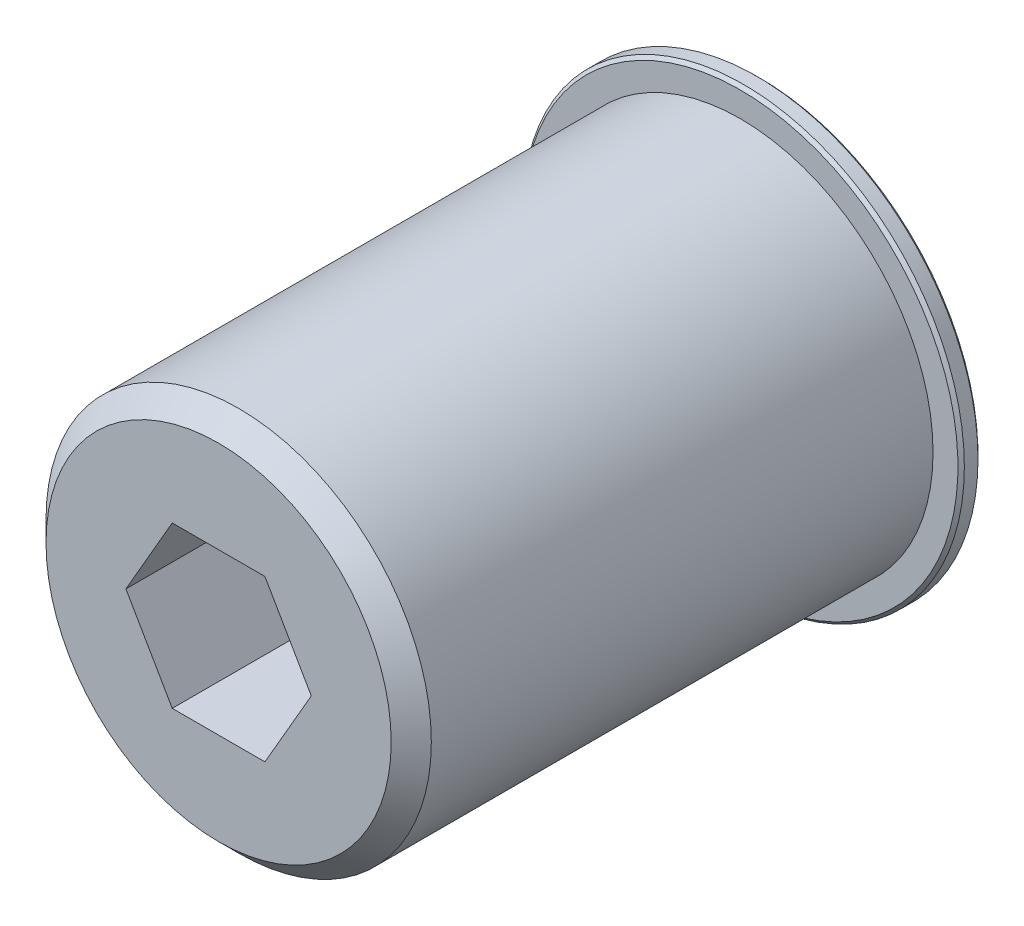
ISO-10303-21;
HEADER;
FILE_DESCRIPTION(('STEP AP214'),'2;1');
FILE_NAME('part.step','',(''),(''),'','','');
FILE_SCHEMA(('AUTOMOTIVE_DESIGN { 1 0 10303 214 1 1 1 1 }'));
ENDSEC;
DATA;
#1=APPLICATION_CONTEXT('core data for automotive mechanical design processes');
#2=APPLICATION_PROTOCOL_DEFINITION('international standard','automotive_design',2000,#1);
#3=PRODUCT_CONTEXT('',#1,'mechanical');
#4=PRODUCT('Part','Part','',(#3));
#5=PRODUCT_RELATED_PRODUCT_CATEGORY('part','',(#4));
#6=PRODUCT_DEFINITION_FORMATION('','',#4);
#7=PRODUCT_DEFINITION_CONTEXT('part definition',#1,'design');
#8=PRODUCT_DEFINITION('design','',#6,#7);
#9=PRODUCT_DEFINITION_SHAPE('','',#8);
#10=(LENGTH_UNIT() NAMED_UNIT(*) SI_UNIT(.MILLI.,.METRE.));
#11=(NAMED_UNIT(*) PLANE_ANGLE_UNIT() SI_UNIT($,.RADIAN.));
#12=(NAMED_UNIT(*) SI_UNIT($,.STERADIAN.) SOLID_ANGLE_UNIT());
#13=UNCERTAINTY_MEASURE_WITH_UNIT(LENGTH_MEASURE(1.E-05),#10,'distance_accuracy_value','');
#14=(GEOMETRIC_REPRESENTATION_CONTEXT(3) GLOBAL_UNCERTAINTY_ASSIGNED_CONTEXT((#13)) GLOBAL_UNIT_ASSIGNED_CONTEXT((#10,
#11,#12)) REPRESENTATION_CONTEXT('',''));
#15=CARTESIAN_POINT('',(0.,0.,0.));
#16=DIRECTION('',(0.,0.,1.));
#17=DIRECTION('',(1.,0.,0.));
#18=AXIS2_PLACEMENT_3D('',#15,#16,#17);
#19=CARTESIAN_POINT('',(0.,0.,-20.6375));
#20=DIRECTION('',(0.,0.,1.));
#21=DIRECTION('',(1.,0.,0.));
#22=AXIS2_PLACEMENT_3D('',#19,#20,#21);
#23=CYLINDRICAL_SURFACE('',#22,15.24);
#24=CARTESIAN_POINT('',(0.,0.,19.05));
#25=DIRECTION('',(0.,0.,1.));
#26=DIRECTION('',(1.,0.,0.));
#27=AXIS2_PLACEMENT_3D('',#24,#25,#26);
#28=CIRCLE('',#27,15.24);
#29=CARTESIAN_POINT('',(15.24,0.,19.05));
#30=VERTEX_POINT('',#29);
#31=EDGE_CURVE('E143',#30,#30,#28,.F.);
#32=ORIENTED_EDGE('',*,*,#31,.T.);
#33=EDGE_LOOP('',(#32));
#34=FACE_BOUND('',#33,.T.);
#35=CARTESIAN_POINT('',(0.,0.,-20.6375));
#36=DIRECTION('',(0.,0.,-1.));
#37=DIRECTION('',(-1.,0.,0.));
#38=AXIS2_PLACEMENT_3D('',#35,#36,#37);
#39=CIRCLE('',#38,15.24);
#40=CARTESIAN_POINT('',(-15.24,0.,-20.6375));
#41=VERTEX_POINT('',#40);
#42=EDGE_CURVE('E130',#41,#41,#39,.F.);
#43=ORIENTED_EDGE('',*,*,#42,.T.);
#44=EDGE_LOOP('',(#43));
#45=FACE_BOUND('',#44,.T.);
#46=ADVANCED_FACE('F32',(#34,#45),#23,.T.);
#47=CARTESIAN_POINT('',(0.,0.,20.6375));
#48=DIRECTION('',(0.,0.,1.));
#49=DIRECTION('',(1.,0.,0.));
#50=AXIS2_PLACEMENT_3D('',#47,#48,#49);
#51=PLANE('',#50);
#52=DIRECTION('',(-0.5,0.866025403784439,0.));
#53=VECTOR('',#52,1.);
#54=CARTESIAN_POINT('',(-3.66617420935412,-6.35,20.6375));
#55=LINE('',#54,#53);
#56=CARTESIAN_POINT('',(-3.66617420935412,-6.35,20.6375));
#57=VERTEX_POINT('',#56);
#58=CARTESIAN_POINT('',(-7.33234841870825,0.,20.6375));
#59=VERTEX_POINT('',#58);
#60=EDGE_CURVE('E87',#57,#59,#55,.T.);
#61=ORIENTED_EDGE('',*,*,#60,.T.);
#62=DIRECTION('',(0.5,0.866025403784439,0.));
#63=VECTOR('',#62,1.);
#64=CARTESIAN_POINT('',(-7.33234841870825,0.,20.6375));
#65=LINE('',#64,#63);
#66=CARTESIAN_POINT('',(-3.66617420935412,6.35,20.6375));
#67=VERTEX_POINT('',#66);
#68=EDGE_CURVE('E96',#59,#67,#65,.T.);
#69=ORIENTED_EDGE('',*,*,#68,.T.);
#70=DIRECTION('',(1.,0.,0.));
#71=VECTOR('',#70,1.);
#72=CARTESIAN_POINT('',(-3.66617420935412,6.35,20.6375));
#73=LINE('',#72,#71);
#74=CARTESIAN_POINT('',(3.66617420935412,6.35,20.6375));
#75=VERTEX_POINT('',#74);
#76=EDGE_CURVE('E47',#67,#75,#73,.T.);
#77=ORIENTED_EDGE('',*,*,#76,.T.);
#78=DIRECTION('',(0.5,-0.866025403784439,0.));
#79=VECTOR('',#78,1.);
#80=CARTESIAN_POINT('',(3.66617420935412,6.35,20.6375));
#81=LINE('',#80,#79);
#82=CARTESIAN_POINT('',(7.33234841870825,0.,20.6375));
#83=VERTEX_POINT('',#82);
#84=EDGE_CURVE('E111',#75,#83,#81,.T.);
#85=ORIENTED_EDGE('',*,*,#84,.T.);
#86=DIRECTION('',(-0.5,-0.866025403784439,0.));
#87=VECTOR('',#86,1.);
#88=CARTESIAN_POINT('',(7.33234841870825,0.,20.6375));
#89=LINE('',#88,#87);
#90=CARTESIAN_POINT('',(3.66617420935412,-6.35,20.6375));
#91=VERTEX_POINT('',#90);
#92=EDGE_CURVE('E114',#83,#91,#89,.T.);
#93=ORIENTED_EDGE('',*,*,#92,.T.);
#94=DIRECTION('',(-1.,0.,0.));
#95=VECTOR('',#94,1.);
#96=CARTESIAN_POINT('',(3.66617420935412,-6.35,20.6375));
#97=LINE('',#96,#95);
#98=EDGE_CURVE('E93',#91,#57,#97,.T.);
#99=ORIENTED_EDGE('',*,*,#98,.T.);
#100=EDGE_LOOP('',(#61,#69,#77,#85,#93,#99));
#101=FACE_BOUND('',#100,.T.);
#102=CARTESIAN_POINT('',(0.,0.,20.6375));
#103=DIRECTION('',(0.,0.,1.));
#104=DIRECTION('',(1.,0.,0.));
#105=AXIS2_PLACEMENT_3D('',#102,#103,#104);
#106=CIRCLE('',#105,13.6525);
#107=CARTESIAN_POINT('',(13.6525,0.,20.6375));
#108=VERTEX_POINT('',#107);
#109=EDGE_CURVE('E140',#108,#108,#106,.T.);
#110=ORIENTED_EDGE('',*,*,#109,.T.);
#111=EDGE_LOOP('',(#110));
#112=FACE_BOUND('',#111,.T.);
#113=ADVANCED_FACE('F100',(#101,#112),#51,.T.);
#114=CARTESIAN_POINT('',(0.,0.,20.6375));
#115=DIRECTION('',(0.,0.,-1.));
#116=DIRECTION('',(-1.,0.,0.));
#117=AXIS2_PLACEMENT_3D('',#114,#115,#116);
#118=CONICAL_SURFACE('',#117,13.6525,0.785398163397448);
#119=ORIENTED_EDGE('',*,*,#31,.F.);
#120=EDGE_LOOP('',(#119));
#121=FACE_BOUND('',#120,.T.);
#122=ORIENTED_EDGE('',*,*,#109,.F.);
#123=EDGE_LOOP('',(#122));
#124=FACE_BOUND('',#123,.T.);
#125=ADVANCED_FACE('F166',(#121,#124),#118,.T.);
#126=CARTESIAN_POINT('',(0.,0.,-22.225));
#127=DIRECTION('',(0.,0.,1.));
#128=DIRECTION('',(1.,0.,0.));
#129=AXIS2_PLACEMENT_3D('',#126,#127,#128);
#130=CYLINDRICAL_SURFACE('',#129,17.4625);
#131=CARTESIAN_POINT('',(0.,0.,-20.8915));
#132=DIRECTION('',(0.,0.,-1.));
#133=DIRECTION('',(-1.,0.,0.));
#134=AXIS2_PLACEMENT_3D('',#131,#132,#133);
#135=CIRCLE('',#134,17.4625);
#136=CARTESIAN_POINT('',(-17.4625,0.,-20.8915));
#137=VERTEX_POINT('',#136);
#138=EDGE_CURVE('E149',#137,#137,#135,.T.);
#139=ORIENTED_EDGE('',*,*,#138,.T.);
#140=EDGE_LOOP('',(#139));
#141=FACE_BOUND('',#140,.T.);
#142=CARTESIAN_POINT('',(0.,0.,-21.971));
#143=DIRECTION('',(0.,0.,-1.));
#144=DIRECTION('',(-1.,0.,0.));
#145=AXIS2_PLACEMENT_3D('',#142,#143,#144);
#146=CIRCLE('',#145,17.4625);
#147=CARTESIAN_POINT('',(-17.4625,0.,-21.971));
#148=VERTEX_POINT('',#147);
#149=EDGE_CURVE('E146',#148,#148,#146,.F.);
#150=ORIENTED_EDGE('',*,*,#149,.T.);
#151=EDGE_LOOP('',(#150));
#152=FACE_BOUND('',#151,.T.);
#153=ADVANCED_FACE('F162',(#141,#152),#130,.T.);
#154=CARTESIAN_POINT('',(0.,0.,-22.225));
#155=DIRECTION('',(0.,0.,-1.));
#156=DIRECTION('',(-1.,0.,0.));
#157=AXIS2_PLACEMENT_3D('',#154,#155,#156);
#158=PLANE('',#157);
#159=CARTESIAN_POINT('',(0.,0.,-22.225));
#160=DIRECTION('',(0.,0.,-1.));
#161=DIRECTION('',(-1.,0.,0.));
#162=AXIS2_PLACEMENT_3D('',#159,#160,#161);
#163=CIRCLE('',#162,17.2085);
#164=CARTESIAN_POINT('',(-17.2085,0.,-22.225));
#165=VERTEX_POINT('',#164);
#166=EDGE_CURVE('E11',#165,#165,#163,.T.);
#167=ORIENTED_EDGE('',*,*,#166,.T.);
#168=EDGE_LOOP('',(#167));
#169=FACE_BOUND('',#168,.T.);
#170=DIRECTION('',(-0.5,0.866025403784439,0.));
#171=VECTOR('',#170,1.);
#172=CARTESIAN_POINT('',(-3.66617420935412,-6.35,-22.225));
#173=LINE('',#172,#171);
#174=CARTESIAN_POINT('',(-3.66617420935412,-6.35,-22.225));
#175=VERTEX_POINT('',#174);
#176=CARTESIAN_POINT('',(-7.33234841870825,0.,-22.225));
#177=VERTEX_POINT('',#176);
#178=EDGE_CURVE('E55',#175,#177,#173,.T.);
#179=ORIENTED_EDGE('',*,*,#178,.F.);
#180=DIRECTION('',(-1.,0.,0.));
#181=VECTOR('',#180,1.);
#182=CARTESIAN_POINT('',(3.66617420935412,-6.35,-22.225));
#183=LINE('',#182,#181);
#184=CARTESIAN_POINT('',(3.66617420935412,-6.35,-22.225));
#185=VERTEX_POINT('',#184);
#186=EDGE_CURVE('E104',#185,#175,#183,.T.);
#187=ORIENTED_EDGE('',*,*,#186,.F.);
#188=DIRECTION('',(-0.5,-0.866025403784439,0.));
#189=VECTOR('',#188,1.);
#190=CARTESIAN_POINT('',(7.33234841870825,0.,-22.225));
#191=LINE('',#190,#189);
#192=CARTESIAN_POINT('',(7.33234841870825,0.,-22.225));
#193=VERTEX_POINT('',#192);
#194=EDGE_CURVE('E107',#193,#185,#191,.T.);
#195=ORIENTED_EDGE('',*,*,#194,.F.);
#196=DIRECTION('',(0.5,-0.866025403784439,0.));
#197=VECTOR('',#196,1.);
#198=CARTESIAN_POINT('',(3.66617420935412,6.35,-22.225));
#199=LINE('',#198,#197);
#200=CARTESIAN_POINT('',(3.66617420935412,6.35,-22.225));
#201=VERTEX_POINT('',#200);
#202=EDGE_CURVE('E123',#201,#193,#199,.T.);
#203=ORIENTED_EDGE('',*,*,#202,.F.);
#204=DIRECTION('',(1.,0.,0.));
#205=VECTOR('',#204,1.);
#206=CARTESIAN_POINT('',(-3.66617420935412,6.35,-22.225));
#207=LINE('',#206,#205);
#208=CARTESIAN_POINT('',(-3.66617420935412,6.35,-22.225));
#209=VERTEX_POINT('',#208);
#210=EDGE_CURVE('E120',#209,#201,#207,.T.);
#211=ORIENTED_EDGE('',*,*,#210,.F.);
#212=DIRECTION('',(0.5,0.866025403784439,0.));
#213=VECTOR('',#212,1.);
#214=CARTESIAN_POINT('',(-7.33234841870825,0.,-22.225));
#215=LINE('',#214,#213);
#216=EDGE_CURVE('E118',#177,#209,#215,.T.);
#217=ORIENTED_EDGE('',*,*,#216,.F.);
#218=EDGE_LOOP('',(#179,#187,#195,#203,#211,#217));
#219=FACE_BOUND('',#218,.T.);
#220=ADVANCED_FACE('F165',(#169,#219),#158,.T.);
#221=CARTESIAN_POINT('',(0.,0.,-20.6375));
#222=DIRECTION('',(0.,0.,-1.));
#223=DIRECTION('',(-1.,0.,0.));
#224=AXIS2_PLACEMENT_3D('',#221,#222,#223);
#225=PLANE('',#224);
#226=CARTESIAN_POINT('',(0.,0.,-20.6375));
#227=DIRECTION('',(0.,0.,-1.));
#228=DIRECTION('',(-1.,0.,0.));
#229=AXIS2_PLACEMENT_3D('',#226,#227,#228);
#230=CIRCLE('',#229,17.2085);
#231=CARTESIAN_POINT('',(-17.2085,0.,-20.6375));
#232=VERTEX_POINT('',#231);
#233=EDGE_CURVE('E40',#232,#232,#230,.F.);
#234=ORIENTED_EDGE('',*,*,#233,.T.);
#235=EDGE_LOOP('',(#234));
#236=FACE_BOUND('',#235,.T.);
#237=ORIENTED_EDGE('',*,*,#42,.F.);
#238=EDGE_LOOP('',(#237));
#239=FACE_BOUND('',#238,.T.);
#240=ADVANCED_FACE('F154',(#236,#239),#225,.F.);
#241=CARTESIAN_POINT('',(-3.66617420935412,-6.35,20.6375));
#242=DIRECTION('',(-0.866025403784439,-0.5,0.));
#243=DIRECTION('',(0.5,-0.866025403784439,0.));
#244=AXIS2_PLACEMENT_3D('',#241,#242,#243);
#245=PLANE('',#244);
#246=ORIENTED_EDGE('',*,*,#178,.T.);
#247=DIRECTION('',(0.,0.,-1.));
#248=VECTOR('',#247,1.);
#249=CARTESIAN_POINT('',(-7.33234841870825,0.,20.6375));
#250=LINE('',#249,#248);
#251=EDGE_CURVE('E83',#59,#177,#250,.T.);
#252=ORIENTED_EDGE('',*,*,#251,.F.);
#253=ORIENTED_EDGE('',*,*,#60,.F.);
#254=DIRECTION('',(0.,0.,-1.));
#255=VECTOR('',#254,1.);
#256=CARTESIAN_POINT('',(-3.66617420935412,-6.35,20.6375));
#257=LINE('',#256,#255);
#258=EDGE_CURVE('E128',#57,#175,#257,.T.);
#259=ORIENTED_EDGE('',*,*,#258,.T.);
#260=EDGE_LOOP('',(#246,#252,#253,#259));
#261=FACE_BOUND('',#260,.T.);
#262=ADVANCED_FACE('F85',(#261),#245,.F.);
#263=CARTESIAN_POINT('',(3.66617420935412,-6.35,20.6375));
#264=DIRECTION('',(0.,-1.,0.));
#265=DIRECTION('',(1.,0.,0.));
#266=AXIS2_PLACEMENT_3D('',#263,#264,#265);
#267=PLANE('',#266);
#268=ORIENTED_EDGE('',*,*,#186,.T.);
#269=ORIENTED_EDGE('',*,*,#258,.F.);
#270=ORIENTED_EDGE('',*,*,#98,.F.);
#271=DIRECTION('',(0.,0.,-1.));
#272=VECTOR('',#271,1.);
#273=CARTESIAN_POINT('',(3.66617420935412,-6.35,20.6375));
#274=LINE('',#273,#272);
#275=EDGE_CURVE('E131',#91,#185,#274,.T.);
#276=ORIENTED_EDGE('',*,*,#275,.T.);
#277=EDGE_LOOP('',(#268,#269,#270,#276));
#278=FACE_BOUND('',#277,.T.);
#279=ADVANCED_FACE('F189',(#278),#267,.F.);
#280=CARTESIAN_POINT('',(7.33234841870825,0.,20.6375));
#281=DIRECTION('',(0.866025403784439,-0.5,0.));
#282=DIRECTION('',(0.5,0.866025403784439,0.));
#283=AXIS2_PLACEMENT_3D('',#280,#281,#282);
#284=PLANE('',#283);
#285=ORIENTED_EDGE('',*,*,#194,.T.);
#286=ORIENTED_EDGE('',*,*,#275,.F.);
#287=ORIENTED_EDGE('',*,*,#92,.F.);
#288=DIRECTION('',(0.,0.,-1.));
#289=VECTOR('',#288,1.);
#290=CARTESIAN_POINT('',(7.33234841870825,0.,20.6375));
#291=LINE('',#290,#289);
#292=EDGE_CURVE('E133',#83,#193,#291,.T.);
#293=ORIENTED_EDGE('',*,*,#292,.T.);
#294=EDGE_LOOP('',(#285,#286,#287,#293));
#295=FACE_BOUND('',#294,.T.);
#296=ADVANCED_FACE('F187',(#295),#284,.F.);
#297=CARTESIAN_POINT('',(3.66617420935412,6.35,20.6375));
#298=DIRECTION('',(0.866025403784439,0.5,0.));
#299=DIRECTION('',(-0.5,0.866025403784439,0.));
#300=AXIS2_PLACEMENT_3D('',#297,#298,#299);
#301=PLANE('',#300);
#302=ORIENTED_EDGE('',*,*,#202,.T.);
#303=ORIENTED_EDGE('',*,*,#292,.F.);
#304=ORIENTED_EDGE('',*,*,#84,.F.);
#305=DIRECTION('',(0.,0.,-1.));
#306=VECTOR('',#305,1.);
#307=CARTESIAN_POINT('',(3.66617420935412,6.35,20.6375));
#308=LINE('',#307,#306);
#309=EDGE_CURVE('E135',#75,#201,#308,.T.);
#310=ORIENTED_EDGE('',*,*,#309,.T.);
#311=EDGE_LOOP('',(#302,#303,#304,#310));
#312=FACE_BOUND('',#311,.T.);
#313=ADVANCED_FACE('F184',(#312),#301,.F.);
#314=CARTESIAN_POINT('',(-3.66617420935412,6.35,20.6375));
#315=DIRECTION('',(0.,1.,0.));
#316=DIRECTION('',(-1.,0.,0.));
#317=AXIS2_PLACEMENT_3D('',#314,#315,#316);
#318=PLANE('',#317);
#319=ORIENTED_EDGE('',*,*,#210,.T.);
#320=ORIENTED_EDGE('',*,*,#309,.F.);
#321=ORIENTED_EDGE('',*,*,#76,.F.);
#322=DIRECTION('',(0.,0.,-1.));
#323=VECTOR('',#322,1.);
#324=CARTESIAN_POINT('',(-3.66617420935412,6.35,20.6375));
#325=LINE('',#324,#323);
#326=EDGE_CURVE('E92',#67,#209,#325,.T.);
#327=ORIENTED_EDGE('',*,*,#326,.T.);
#328=EDGE_LOOP('',(#319,#320,#321,#327));
#329=FACE_BOUND('',#328,.T.);
#330=ADVANCED_FACE('F181',(#329),#318,.F.);
#331=CARTESIAN_POINT('',(-7.33234841870825,0.,20.6375));
#332=DIRECTION('',(-0.866025403784439,0.5,0.));
#333=DIRECTION('',(-0.5,-0.866025403784439,0.));
#334=AXIS2_PLACEMENT_3D('',#331,#332,#333);
#335=PLANE('',#334);
#336=ORIENTED_EDGE('',*,*,#216,.T.);
#337=ORIENTED_EDGE('',*,*,#326,.F.);
#338=ORIENTED_EDGE('',*,*,#68,.F.);
#339=ORIENTED_EDGE('',*,*,#251,.T.);
#340=EDGE_LOOP('',(#336,#337,#338,#339));
#341=FACE_BOUND('',#340,.T.);
#342=ADVANCED_FACE('F97',(#341),#335,.F.);
#343=CARTESIAN_POINT('',(0.,0.,-20.8915));
#344=DIRECTION('',(0.,0.,-1.));
#345=DIRECTION('',(-1.,0.,0.));
#346=AXIS2_PLACEMENT_3D('',#343,#344,#345);
#347=CONICAL_SURFACE('',#346,17.4625,0.785398163397442);
#348=ORIENTED_EDGE('',*,*,#233,.F.);
#349=EDGE_LOOP('',(#348));
#350=FACE_BOUND('',#349,.T.);
#351=ORIENTED_EDGE('',*,*,#138,.F.);
#352=EDGE_LOOP('',(#351));
#353=FACE_BOUND('',#352,.T.);
#354=ADVANCED_FACE('F157',(#350,#353),#347,.T.);
#355=CARTESIAN_POINT('',(0.,0.,-22.225));
#356=DIRECTION('',(0.,0.,1.));
#357=DIRECTION('',(1.,0.,0.));
#358=AXIS2_PLACEMENT_3D('',#355,#356,#357);
#359=CONICAL_SURFACE('',#358,17.2085,0.785398163397448);
#360=ORIENTED_EDGE('',*,*,#149,.F.);
#361=EDGE_LOOP('',(#360));
#362=FACE_BOUND('',#361,.T.);
#363=ORIENTED_EDGE('',*,*,#166,.F.);
#364=EDGE_LOOP('',(#363));
#365=FACE_BOUND('',#364,.T.);
#366=ADVANCED_FACE('F34',(#362,#365),#359,.T.);
#367=CLOSED_SHELL('',(#46,#113,#125,#153,#220,#240,#262,#279,#296,#313,#330,#342,#354,#366));
#368=MANIFOLD_SOLID_BREP('B2',#367);
#369=ADVANCED_BREP_SHAPE_REPRESENTATION('',(#18,#368),#14);
#370=SHAPE_DEFINITION_REPRESENTATION(#9,#369);
ENDSEC;
END-ISO-10303-21;
